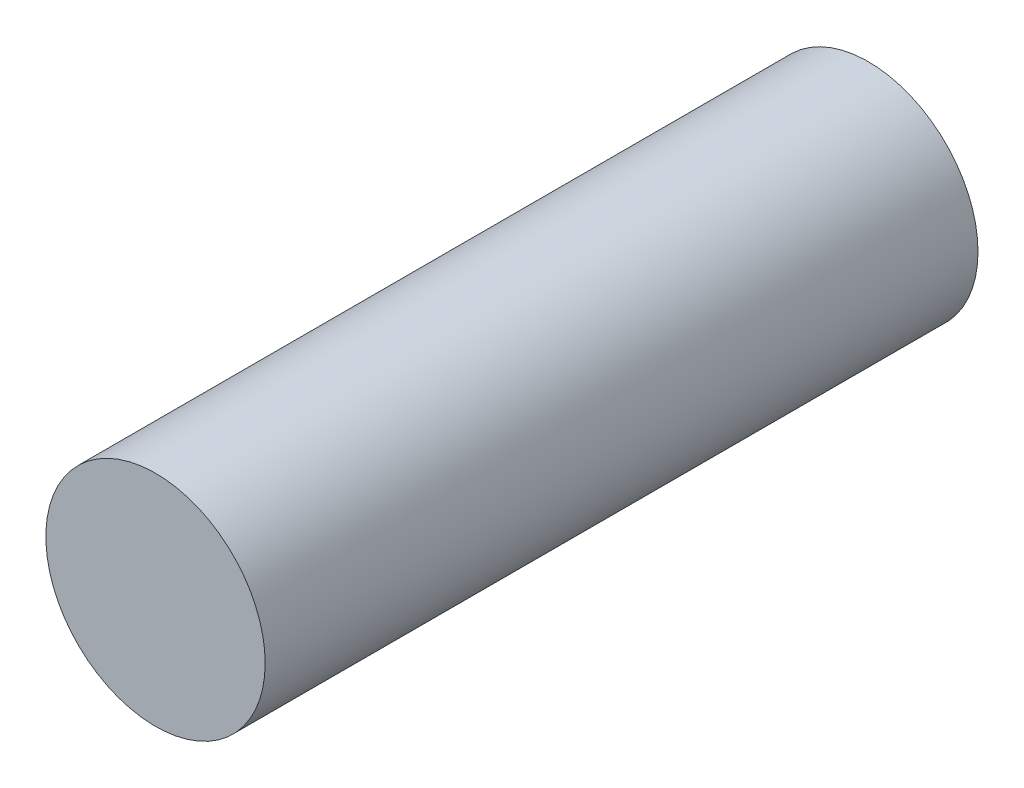
ISO-10303-21;
HEADER;
FILE_DESCRIPTION(('STEP AP214'),'2;1');
FILE_NAME('part.step','',(''),(''),'','','');
FILE_SCHEMA(('AUTOMOTIVE_DESIGN { 1 0 10303 214 1 1 1 1 }'));
ENDSEC;
DATA;
#1=APPLICATION_CONTEXT('core data for automotive mechanical design processes');
#2=APPLICATION_PROTOCOL_DEFINITION('international standard','automotive_design',2000,#1);
#3=PRODUCT_CONTEXT('',#1,'mechanical');
#4=PRODUCT('Part','Part','',(#3));
#5=PRODUCT_RELATED_PRODUCT_CATEGORY('part','',(#4));
#6=PRODUCT_DEFINITION_FORMATION('','',#4);
#7=PRODUCT_DEFINITION_CONTEXT('part definition',#1,'design');
#8=PRODUCT_DEFINITION('design','',#6,#7);
#9=PRODUCT_DEFINITION_SHAPE('','',#8);
#10=(LENGTH_UNIT() NAMED_UNIT(*) SI_UNIT(.MILLI.,.METRE.));
#11=(NAMED_UNIT(*) PLANE_ANGLE_UNIT() SI_UNIT($,.RADIAN.));
#12=(NAMED_UNIT(*) SI_UNIT($,.STERADIAN.) SOLID_ANGLE_UNIT());
#13=UNCERTAINTY_MEASURE_WITH_UNIT(LENGTH_MEASURE(1.E-05),#10,'distance_accuracy_value','');
#14=(GEOMETRIC_REPRESENTATION_CONTEXT(3) GLOBAL_UNCERTAINTY_ASSIGNED_CONTEXT((#13)) GLOBAL_UNIT_ASSIGNED_CONTEXT((#10,
#11,#12)) REPRESENTATION_CONTEXT('',''));
#15=CARTESIAN_POINT('',(0.,0.,0.));
#16=DIRECTION('',(0.,0.,1.));
#17=DIRECTION('',(1.,0.,0.));
#18=AXIS2_PLACEMENT_3D('',#15,#16,#17);
#19=CARTESIAN_POINT('',(0.,0.,65.));
#20=DIRECTION('',(0.,0.,-1.));
#21=DIRECTION('',(-1.,0.,0.));
#22=AXIS2_PLACEMENT_3D('',#19,#20,#21);
#23=CYLINDRICAL_SURFACE('',#22,10.);
#24=CARTESIAN_POINT('',(0.,0.,65.));
#25=DIRECTION('',(0.,0.,1.));
#26=DIRECTION('',(1.,0.,0.));
#27=AXIS2_PLACEMENT_3D('',#24,#25,#26);
#28=CIRCLE('',#27,10.);
#29=CARTESIAN_POINT('',(10.,0.,65.));
#30=VERTEX_POINT('',#29);
#31=EDGE_CURVE('E10',#30,#30,#28,.T.);
#32=ORIENTED_EDGE('',*,*,#31,.F.);
#33=EDGE_LOOP('',(#32));
#34=FACE_BOUND('',#33,.T.);
#35=CARTESIAN_POINT('',(0.,0.,0.));
#36=DIRECTION('',(0.,0.,1.));
#37=DIRECTION('',(1.,0.,0.));
#38=AXIS2_PLACEMENT_3D('',#35,#36,#37);
#39=CIRCLE('',#38,10.);
#40=CARTESIAN_POINT('',(10.,0.,0.));
#41=VERTEX_POINT('',#40);
#42=EDGE_CURVE('E44',#41,#41,#39,.T.);
#43=ORIENTED_EDGE('',*,*,#42,.T.);
#44=EDGE_LOOP('',(#43));
#45=FACE_BOUND('',#44,.T.);
#46=ADVANCED_FACE('F41',(#34,#45),#23,.T.);
#47=CARTESIAN_POINT('',(0.,0.,65.));
#48=DIRECTION('',(0.,0.,1.));
#49=DIRECTION('',(1.,0.,0.));
#50=AXIS2_PLACEMENT_3D('',#47,#48,#49);
#51=PLANE('',#50);
#52=ORIENTED_EDGE('',*,*,#31,.T.);
#53=EDGE_LOOP('',(#52));
#54=FACE_BOUND('',#53,.T.);
#55=ADVANCED_FACE('F58',(#54),#51,.T.);
#56=CARTESIAN_POINT('',(0.,0.,0.));
#57=DIRECTION('',(0.,0.,1.));
#58=DIRECTION('',(1.,0.,0.));
#59=AXIS2_PLACEMENT_3D('',#56,#57,#58);
#60=PLANE('',#59);
#61=ORIENTED_EDGE('',*,*,#42,.F.);
#62=EDGE_LOOP('',(#61));
#63=FACE_BOUND('',#62,.T.);
#64=ADVANCED_FACE('F56',(#63),#60,.F.);
#65=CLOSED_SHELL('',(#46,#55,#64));
#66=MANIFOLD_SOLID_BREP('B2',#65);
#67=ADVANCED_BREP_SHAPE_REPRESENTATION('',(#18,#66),#14);
#68=SHAPE_DEFINITION_REPRESENTATION(#9,#67);
ENDSEC;
END-ISO-10303-21;
